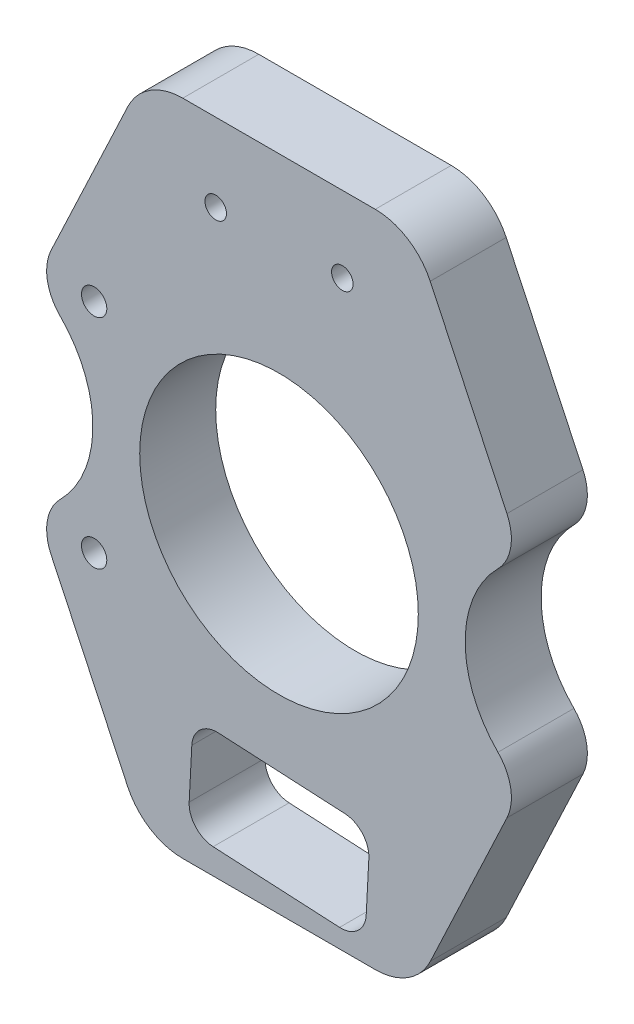
ISO-10303-21;
HEADER;
FILE_DESCRIPTION(('STEP AP214'),'2;1');
FILE_NAME('part.step','',(''),(''),'','','');
FILE_SCHEMA(('AUTOMOTIVE_DESIGN { 1 0 10303 214 1 1 1 1 }'));
ENDSEC;
DATA;
#1=APPLICATION_CONTEXT('core data for automotive mechanical design processes');
#2=APPLICATION_PROTOCOL_DEFINITION('international standard','automotive_design',2000,#1);
#3=PRODUCT_CONTEXT('',#1,'mechanical');
#4=PRODUCT('Part','Part','',(#3));
#5=PRODUCT_RELATED_PRODUCT_CATEGORY('part','',(#4));
#6=PRODUCT_DEFINITION_FORMATION('','',#4);
#7=PRODUCT_DEFINITION_CONTEXT('part definition',#1,'design');
#8=PRODUCT_DEFINITION('design','',#6,#7);
#9=PRODUCT_DEFINITION_SHAPE('','',#8);
#10=(LENGTH_UNIT() NAMED_UNIT(*) SI_UNIT(.MILLI.,.METRE.));
#11=(NAMED_UNIT(*) PLANE_ANGLE_UNIT() SI_UNIT($,.RADIAN.));
#12=(NAMED_UNIT(*) SI_UNIT($,.STERADIAN.) SOLID_ANGLE_UNIT());
#13=UNCERTAINTY_MEASURE_WITH_UNIT(LENGTH_MEASURE(1.E-05),#10,'distance_accuracy_value','');
#14=(GEOMETRIC_REPRESENTATION_CONTEXT(3) GLOBAL_UNCERTAINTY_ASSIGNED_CONTEXT((#13)) GLOBAL_UNIT_ASSIGNED_CONTEXT((#10,
#11,#12)) REPRESENTATION_CONTEXT('',''));
#15=CARTESIAN_POINT('',(0.,0.,0.));
#16=DIRECTION('',(0.,0.,1.));
#17=DIRECTION('',(1.,0.,0.));
#18=AXIS2_PLACEMENT_3D('',#15,#16,#17);
#19=CARTESIAN_POINT('',(38.0693004201398,23.9998999467089,30.));
#20=DIRECTION('',(0.,0.,-1.));
#21=DIRECTION('',(-1.,0.,0.));
#22=AXIS2_PLACEMENT_3D('',#19,#20,#21);
#23=PLANE('',#22);
#24=DIRECTION('',(-0.998629534754574,0.0523359562429441,0.));
#25=VECTOR('',#24,1.);
#26=CARTESIAN_POINT('',(-35.998752841269,10.5489732913392,30.));
#27=LINE('',#26,#25);
#28=CARTESIAN_POINT('',(23.9190192440055,7.4088159167626,30.));
#29=VERTEX_POINT('',#28);
#30=CARTESIAN_POINT('',(-26.0124574937233,10.0256137289098,30.));
#31=VERTEX_POINT('',#30);
#32=EDGE_CURVE('E380',#29,#31,#27,.T.);
#33=ORIENTED_EDGE('',*,*,#32,.T.);
#34=CARTESIAN_POINT('',(-25.4890979312938,20.0119090764555,30.));
#35=DIRECTION('',(0.,0.,-1.));
#36=DIRECTION('',(-1.,0.,0.));
#37=AXIS2_PLACEMENT_3D('',#34,#35,#36);
#38=CIRCLE('',#37,10.);
#39=CARTESIAN_POINT('',(-35.4753932788395,20.535268638885,30.));
#40=VERTEX_POINT('',#39);
#41=EDGE_CURVE('E353',#31,#40,#38,.T.);
#42=ORIENTED_EDGE('',*,*,#41,.T.);
#43=DIRECTION('',(0.0523359562429445,0.998629534754574,0.));
#44=VECTOR('',#43,1.);
#45=CARTESIAN_POINT('',(-33.9053145915512,50.4941546815222,30.));
#46=LINE('',#45,#44);
#47=CARTESIAN_POINT('',(-34.4286741539807,40.5078593339764,30.));
#48=VERTEX_POINT('',#47);
#49=EDGE_CURVE('E382',#40,#48,#46,.T.);
#50=ORIENTED_EDGE('',*,*,#49,.T.);
#51=CARTESIAN_POINT('',(-24.4423788064349,39.984499771547,30.));
#52=DIRECTION('',(0.,0.,-1.));
#53=DIRECTION('',(-1.,0.,0.));
#54=AXIS2_PLACEMENT_3D('',#51,#52,#53);
#55=CIRCLE('',#54,10.);
#56=CARTESIAN_POINT('',(-23.9190192440055,49.9707951190927,30.));
#57=VERTEX_POINT('',#56);
#58=EDGE_CURVE('E61',#48,#57,#55,.T.);
#59=ORIENTED_EDGE('',*,*,#58,.T.);
#60=DIRECTION('',(0.998629534754574,-0.0523359562429446,0.));
#61=VECTOR('',#60,1.);
#62=CARTESIAN_POINT('',(35.998752841269,46.830637744516,30.));
#63=LINE('',#62,#61);
#64=CARTESIAN_POINT('',(26.0124574937232,47.3539973069455,30.));
#65=VERTEX_POINT('',#64);
#66=EDGE_CURVE('E376',#57,#65,#63,.T.);
#67=ORIENTED_EDGE('',*,*,#66,.T.);
#68=CARTESIAN_POINT('',(25.4890979312938,37.3677019593998,30.));
#69=DIRECTION('',(0.,0.,-1.));
#70=DIRECTION('',(-1.,0.,0.));
#71=AXIS2_PLACEMENT_3D('',#68,#69,#70);
#72=CIRCLE('',#71,10.);
#73=CARTESIAN_POINT('',(35.4753932788395,36.8443423969703,30.));
#74=VERTEX_POINT('',#73);
#75=EDGE_CURVE('E11',#65,#74,#72,.T.);
#76=ORIENTED_EDGE('',*,*,#75,.T.);
#77=DIRECTION('',(-0.0523359562429445,-0.998629534754574,0.));
#78=VECTOR('',#77,1.);
#79=CARTESIAN_POINT('',(35.998752841269,46.830637744516,30.));
#80=LINE('',#79,#78);
#81=CARTESIAN_POINT('',(34.4286741539806,16.8717517018789,30.));
#82=VERTEX_POINT('',#81);
#83=EDGE_CURVE('E374',#74,#82,#80,.T.);
#84=ORIENTED_EDGE('',*,*,#83,.T.);
#85=CARTESIAN_POINT('',(24.4423788064349,17.3951112643083,30.));
#86=DIRECTION('',(0.,0.,-1.));
#87=DIRECTION('',(-1.,0.,0.));
#88=AXIS2_PLACEMENT_3D('',#85,#86,#87);
#89=CIRCLE('',#88,10.);
#90=EDGE_CURVE('E349',#82,#29,#89,.T.);
#91=ORIENTED_EDGE('',*,*,#90,.T.);
#92=EDGE_LOOP('',(#33,#42,#50,#59,#67,#76,#84,#91));
#93=FACE_BOUND('',#92,.T.);
#94=DIRECTION('',(1.,-1.29580053179329E-13,0.));
#95=VECTOR('',#94,1.);
#96=CARTESIAN_POINT('',(-38.,4.92404202081449E-12,30.));
#97=LINE('',#96,#95);
#98=CARTESIAN_POINT('',(-38.,5.25274268525777E-12,30.));
#99=VERTEX_POINT('',#98);
#100=CARTESIAN_POINT('',(38.0000000000001,5.61581336988582E-12,30.));
#101=VERTEX_POINT('',#100);
#102=EDGE_CURVE('E200',#99,#101,#97,.T.);
#103=ORIENTED_EDGE('',*,*,#102,.T.);
#104=CARTESIAN_POINT('',(38.0693004201398,23.9998999467089,30.));
#105=DIRECTION('',(0.,0.,1.));
#106=DIRECTION('',(-1.,0.,0.));
#107=AXIS2_PLACEMENT_3D('',#104,#105,#106);
#108=CIRCLE('',#107,24.);
#109=CARTESIAN_POINT('',(59.7661609006696,13.7409406774445,30.));
#110=VERTEX_POINT('',#109);
#111=EDGE_CURVE('E204',#101,#110,#108,.T.);
#112=ORIENTED_EDGE('',*,*,#111,.T.);
#113=DIRECTION('',(0.426346779523004,0.904559795475326,0.));
#114=VECTOR('',#113,1.);
#115=CARTESIAN_POINT('',(59.7661609006696,13.7409406774445,30.));
#116=LINE('',#115,#114);
#117=CARTESIAN_POINT('',(90.0082162674247,77.904079068946,30.));
#118=VERTEX_POINT('',#117);
#119=EDGE_CURVE('E225',#110,#118,#116,.T.);
#120=ORIENTED_EDGE('',*,*,#119,.T.);
#121=CARTESIAN_POINT('',(73.5,85.6849077952408,30.));
#122=DIRECTION('',(0.,0.,1.));
#123=DIRECTION('',(-1.,0.,0.));
#124=AXIS2_PLACEMENT_3D('',#121,#122,#123);
#125=CIRCLE('',#124,18.25);
#126=CARTESIAN_POINT('',(86.4422244101156,98.5519714586494,30.));
#127=VERTEX_POINT('',#126);
#128=EDGE_CURVE('E227',#118,#127,#125,.T.);
#129=ORIENTED_EDGE('',*,*,#128,.T.);
#130=CARTESIAN_POINT('',(117.999977081356,129.926455459837,30.));
#131=DIRECTION('',(0.,0.,-1.));
#132=DIRECTION('',(1.,0.,0.));
#133=AXIS2_PLACEMENT_3D('',#130,#131,#132);
#134=CIRCLE('',#133,44.5);
#135=CARTESIAN_POINT('',(86.4422244101156,161.300939461025,30.));
#136=VERTEX_POINT('',#135);
#137=EDGE_CURVE('E232',#127,#136,#134,.T.);
#138=ORIENTED_EDGE('',*,*,#137,.T.);
#139=CARTESIAN_POINT('',(73.5,174.168003124434,30.));
#140=DIRECTION('',(0.,0.,1.));
#141=DIRECTION('',(1.,0.,0.));
#142=AXIS2_PLACEMENT_3D('',#139,#140,#141);
#143=CIRCLE('',#142,18.25);
#144=CARTESIAN_POINT('',(90.0082162674247,181.948831850729,30.));
#145=VERTEX_POINT('',#144);
#146=EDGE_CURVE('E234',#136,#145,#143,.T.);
#147=ORIENTED_EDGE('',*,*,#146,.T.);
#148=DIRECTION('',(-0.426346779523004,0.904559795475326,0.));
#149=VECTOR('',#148,1.);
#150=CARTESIAN_POINT('',(59.7094350914078,246.232322708552,30.));
#151=LINE('',#150,#149);
#152=CARTESIAN_POINT('',(59.7094350914078,246.232322708552,30.));
#153=VERTEX_POINT('',#152);
#154=EDGE_CURVE('E236',#145,#153,#151,.T.);
#155=ORIENTED_EDGE('',*,*,#154,.T.);
#156=CARTESIAN_POINT('',(38.,236.,30.));
#157=DIRECTION('',(0.,0.,1.));
#158=DIRECTION('',(1.,0.,0.));
#159=AXIS2_PLACEMENT_3D('',#156,#157,#158);
#160=CIRCLE('',#159,24.);
#161=CARTESIAN_POINT('',(38.,260.,30.));
#162=VERTEX_POINT('',#161);
#163=EDGE_CURVE('E238',#153,#162,#160,.T.);
#164=ORIENTED_EDGE('',*,*,#163,.T.);
#165=DIRECTION('',(-1.,0.,0.));
#166=VECTOR('',#165,1.);
#167=CARTESIAN_POINT('',(-38.,260.,30.));
#168=LINE('',#167,#166);
#169=CARTESIAN_POINT('',(-38.,260.,30.));
#170=VERTEX_POINT('',#169);
#171=EDGE_CURVE('E240',#162,#170,#168,.T.);
#172=ORIENTED_EDGE('',*,*,#171,.T.);
#173=CARTESIAN_POINT('',(-38.,236.,30.));
#174=DIRECTION('',(0.,0.,1.));
#175=DIRECTION('',(-1.,0.,0.));
#176=AXIS2_PLACEMENT_3D('',#173,#174,#175);
#177=CIRCLE('',#176,24.);
#178=CARTESIAN_POINT('',(-59.7094350914078,246.232322708552,30.));
#179=VERTEX_POINT('',#178);
#180=EDGE_CURVE('E242',#170,#179,#177,.T.);
#181=ORIENTED_EDGE('',*,*,#180,.T.);
#182=DIRECTION('',(-0.426346779523004,-0.904559795475326,0.));
#183=VECTOR('',#182,1.);
#184=CARTESIAN_POINT('',(-59.7094350914078,246.232322708552,30.));
#185=LINE('',#184,#183);
#186=CARTESIAN_POINT('',(-90.0082162674247,181.948831850729,30.));
#187=VERTEX_POINT('',#186);
#188=EDGE_CURVE('E244',#179,#187,#185,.T.);
#189=ORIENTED_EDGE('',*,*,#188,.T.);
#190=CARTESIAN_POINT('',(-73.5,174.168003124434,30.));
#191=DIRECTION('',(0.,0.,1.));
#192=DIRECTION('',(-1.,0.,0.));
#193=AXIS2_PLACEMENT_3D('',#190,#191,#192);
#194=CIRCLE('',#193,18.25);
#195=CARTESIAN_POINT('',(-86.4422244101156,161.300939461025,30.));
#196=VERTEX_POINT('',#195);
#197=EDGE_CURVE('E246',#187,#196,#194,.T.);
#198=ORIENTED_EDGE('',*,*,#197,.T.);
#199=CARTESIAN_POINT('',(-117.999977081356,129.926455459837,30.));
#200=DIRECTION('',(0.,0.,-1.));
#201=DIRECTION('',(-1.,0.,0.));
#202=AXIS2_PLACEMENT_3D('',#199,#200,#201);
#203=CIRCLE('',#202,44.5);
#204=CARTESIAN_POINT('',(-86.4422244101156,98.5519714586494,30.));
#205=VERTEX_POINT('',#204);
#206=EDGE_CURVE('E248',#196,#205,#203,.T.);
#207=ORIENTED_EDGE('',*,*,#206,.T.);
#208=CARTESIAN_POINT('',(-73.5,85.6849077952408,30.));
#209=DIRECTION('',(0.,0.,1.));
#210=DIRECTION('',(1.,0.,0.));
#211=AXIS2_PLACEMENT_3D('',#208,#209,#210);
#212=CIRCLE('',#211,18.25);
#213=CARTESIAN_POINT('',(-90.0082162674247,77.904079068946,30.));
#214=VERTEX_POINT('',#213);
#215=EDGE_CURVE('E250',#205,#214,#212,.T.);
#216=ORIENTED_EDGE('',*,*,#215,.T.);
#217=DIRECTION('',(0.426346779523004,-0.904559795475326,0.));
#218=VECTOR('',#217,1.);
#219=CARTESIAN_POINT('',(-59.7661609006695,13.7409406774445,30.));
#220=LINE('',#219,#218);
#221=CARTESIAN_POINT('',(-59.7661609006695,13.7409406774445,30.));
#222=VERTEX_POINT('',#221);
#223=EDGE_CURVE('E252',#214,#222,#220,.T.);
#224=ORIENTED_EDGE('',*,*,#223,.T.);
#225=CARTESIAN_POINT('',(-38.0693004201397,23.9998999467089,30.));
#226=DIRECTION('',(0.,0.,1.));
#227=DIRECTION('',(1.,0.,0.));
#228=AXIS2_PLACEMENT_3D('',#225,#226,#227);
#229=CIRCLE('',#228,24.0000000000003);
#230=EDGE_CURVE('E207',#222,#99,#229,.T.);
#231=ORIENTED_EDGE('',*,*,#230,.T.);
#232=EDGE_LOOP('',(#103,#112,#120,#129,#138,#147,#155,#164,#172,#181,#189,#198,#207,#216,#224,#231));
#233=FACE_BOUND('',#232,.T.);
#234=CARTESIAN_POINT('',(0.,130.,30.));
#235=DIRECTION('',(0.,0.,1.));
#236=DIRECTION('',(1.,0.,0.));
#237=AXIS2_PLACEMENT_3D('',#234,#235,#236);
#238=CIRCLE('',#237,55.);
#239=CARTESIAN_POINT('',(55.,130.,30.));
#240=VERTEX_POINT('',#239);
#241=EDGE_CURVE('E258',#240,#240,#238,.T.);
#242=ORIENTED_EDGE('',*,*,#241,.F.);
#243=EDGE_LOOP('',(#242));
#244=FACE_BOUND('',#243,.T.);
#245=CARTESIAN_POINT('',(-73.,173.,30.));
#246=DIRECTION('',(0.,0.,1.));
#247=DIRECTION('',(-1.,0.,0.));
#248=AXIS2_PLACEMENT_3D('',#245,#246,#247);
#249=CIRCLE('',#248,5.00000000000001);
#250=CARTESIAN_POINT('',(-78.,173.,30.));
#251=VERTEX_POINT('',#250);
#252=EDGE_CURVE('E413',#251,#251,#249,.T.);
#253=ORIENTED_EDGE('',*,*,#252,.F.);
#254=EDGE_LOOP('',(#253));
#255=FACE_BOUND('',#254,.T.);
#256=CARTESIAN_POINT('',(-73.,87.,30.));
#257=DIRECTION('',(0.,0.,1.));
#258=DIRECTION('',(1.,0.,0.));
#259=AXIS2_PLACEMENT_3D('',#256,#257,#258);
#260=CIRCLE('',#259,5.00000000000001);
#261=CARTESIAN_POINT('',(-68.,87.,30.));
#262=VERTEX_POINT('',#261);
#263=EDGE_CURVE('E407',#262,#262,#260,.T.);
#264=ORIENTED_EDGE('',*,*,#263,.F.);
#265=EDGE_LOOP('',(#264));
#266=FACE_BOUND('',#265,.T.);
#267=CARTESIAN_POINT('',(-24.9923847578196,229.127379678136,30.));
#268=DIRECTION('',(0.,0.,1.));
#269=DIRECTION('',(1.,0.,0.));
#270=AXIS2_PLACEMENT_3D('',#267,#268,#269);
#271=CIRCLE('',#270,4.25);
#272=CARTESIAN_POINT('',(-20.7423847578196,229.127379678136,30.));
#273=VERTEX_POINT('',#272);
#274=EDGE_CURVE('E401',#273,#273,#271,.T.);
#275=ORIENTED_EDGE('',*,*,#274,.F.);
#276=EDGE_LOOP('',(#275));
#277=FACE_BOUND('',#276,.T.);
#278=CARTESIAN_POINT('',(25.,230.,30.));
#279=DIRECTION('',(0.,0.,1.));
#280=DIRECTION('',(1.,0.,0.));
#281=AXIS2_PLACEMENT_3D('',#278,#279,#280);
#282=CIRCLE('',#281,4.25);
#283=CARTESIAN_POINT('',(29.25,230.,30.));
#284=VERTEX_POINT('',#283);
#285=EDGE_CURVE('E395',#284,#284,#282,.T.);
#286=ORIENTED_EDGE('',*,*,#285,.F.);
#287=EDGE_LOOP('',(#286));
#288=FACE_BOUND('',#287,.T.);
#289=ADVANCED_FACE('F39',(#93,#233,#244,#255,#266,#277,#288),#23,.F.);
#290=CARTESIAN_POINT('',(38.0693004201398,23.9998999467089,0.));
#291=DIRECTION('',(0.,0.,-1.));
#292=DIRECTION('',(-1.,0.,0.));
#293=AXIS2_PLACEMENT_3D('',#290,#291,#292);
#294=PLANE('',#293);
#295=DIRECTION('',(0.998629534754574,-0.0523359562429446,0.));
#296=VECTOR('',#295,1.);
#297=CARTESIAN_POINT('',(35.998752841269,46.830637744516,0.));
#298=LINE('',#297,#296);
#299=CARTESIAN_POINT('',(-23.9190192440055,49.9707951190927,0.));
#300=VERTEX_POINT('',#299);
#301=CARTESIAN_POINT('',(26.0124574937232,47.3539973069455,0.));
#302=VERTEX_POINT('',#301);
#303=EDGE_CURVE('E362',#300,#302,#298,.T.);
#304=ORIENTED_EDGE('',*,*,#303,.F.);
#305=CARTESIAN_POINT('',(-24.4423788064349,39.984499771547,0.));
#306=DIRECTION('',(0.,0.,-1.));
#307=DIRECTION('',(-1.,0.,0.));
#308=AXIS2_PLACEMENT_3D('',#305,#306,#307);
#309=CIRCLE('',#308,10.);
#310=CARTESIAN_POINT('',(-34.4286741539807,40.5078593339764,0.));
#311=VERTEX_POINT('',#310);
#312=EDGE_CURVE('E355',#300,#311,#309,.F.);
#313=ORIENTED_EDGE('',*,*,#312,.T.);
#314=DIRECTION('',(0.0523359562429445,0.998629534754574,0.));
#315=VECTOR('',#314,1.);
#316=CARTESIAN_POINT('',(-33.9053145915512,50.4941546815222,0.));
#317=LINE('',#316,#315);
#318=CARTESIAN_POINT('',(-35.4753932788395,20.535268638885,0.));
#319=VERTEX_POINT('',#318);
#320=EDGE_CURVE('E384',#319,#311,#317,.T.);
#321=ORIENTED_EDGE('',*,*,#320,.F.);
#322=CARTESIAN_POINT('',(-25.4890979312938,20.0119090764555,0.));
#323=DIRECTION('',(0.,0.,-1.));
#324=DIRECTION('',(-1.,0.,0.));
#325=AXIS2_PLACEMENT_3D('',#322,#323,#324);
#326=CIRCLE('',#325,10.);
#327=CARTESIAN_POINT('',(-26.0124574937233,10.0256137289098,0.));
#328=VERTEX_POINT('',#327);
#329=EDGE_CURVE('E351',#319,#328,#326,.F.);
#330=ORIENTED_EDGE('',*,*,#329,.T.);
#331=DIRECTION('',(-0.998629534754574,0.0523359562429441,0.));
#332=VECTOR('',#331,1.);
#333=CARTESIAN_POINT('',(-35.998752841269,10.5489732913392,0.));
#334=LINE('',#333,#332);
#335=CARTESIAN_POINT('',(23.9190192440055,7.4088159167626,0.));
#336=VERTEX_POINT('',#335);
#337=EDGE_CURVE('E390',#336,#328,#334,.T.);
#338=ORIENTED_EDGE('',*,*,#337,.F.);
#339=CARTESIAN_POINT('',(24.4423788064349,17.3951112643083,0.));
#340=DIRECTION('',(0.,0.,-1.));
#341=DIRECTION('',(-1.,0.,0.));
#342=AXIS2_PLACEMENT_3D('',#339,#340,#341);
#343=CIRCLE('',#342,10.);
#344=CARTESIAN_POINT('',(34.4286741539806,16.8717517018789,0.));
#345=VERTEX_POINT('',#344);
#346=EDGE_CURVE('E347',#336,#345,#343,.F.);
#347=ORIENTED_EDGE('',*,*,#346,.T.);
#348=DIRECTION('',(-0.0523359562429445,-0.998629534754574,0.));
#349=VECTOR('',#348,1.);
#350=CARTESIAN_POINT('',(35.998752841269,46.830637744516,0.));
#351=LINE('',#350,#349);
#352=CARTESIAN_POINT('',(35.4753932788395,36.8443423969703,0.));
#353=VERTEX_POINT('',#352);
#354=EDGE_CURVE('E364',#353,#345,#351,.T.);
#355=ORIENTED_EDGE('',*,*,#354,.F.);
#356=CARTESIAN_POINT('',(25.4890979312938,37.3677019593998,0.));
#357=DIRECTION('',(0.,0.,-1.));
#358=DIRECTION('',(-1.,0.,0.));
#359=AXIS2_PLACEMENT_3D('',#356,#357,#358);
#360=CIRCLE('',#359,10.);
#361=EDGE_CURVE('E47',#353,#302,#360,.F.);
#362=ORIENTED_EDGE('',*,*,#361,.T.);
#363=EDGE_LOOP('',(#304,#313,#321,#330,#338,#347,#355,#362));
#364=FACE_BOUND('',#363,.T.);
#365=CARTESIAN_POINT('',(-24.9923847578196,229.127379678136,0.));
#366=DIRECTION('',(0.,0.,1.));
#367=DIRECTION('',(1.,0.,0.));
#368=AXIS2_PLACEMENT_3D('',#365,#366,#367);
#369=CIRCLE('',#368,4.25);
#370=CARTESIAN_POINT('',(-20.7423847578196,229.127379678136,0.));
#371=VERTEX_POINT('',#370);
#372=EDGE_CURVE('E398',#371,#371,#369,.T.);
#373=ORIENTED_EDGE('',*,*,#372,.T.);
#374=EDGE_LOOP('',(#373));
#375=FACE_BOUND('',#374,.T.);
#376=CARTESIAN_POINT('',(-73.,173.,0.));
#377=DIRECTION('',(0.,0.,1.));
#378=DIRECTION('',(-1.,0.,0.));
#379=AXIS2_PLACEMENT_3D('',#376,#377,#378);
#380=CIRCLE('',#379,5.00000000000001);
#381=CARTESIAN_POINT('',(-78.,173.,0.));
#382=VERTEX_POINT('',#381);
#383=EDGE_CURVE('E410',#382,#382,#380,.T.);
#384=ORIENTED_EDGE('',*,*,#383,.T.);
#385=EDGE_LOOP('',(#384));
#386=FACE_BOUND('',#385,.T.);
#387=DIRECTION('',(1.,1.47784562365416E-13,0.));
#388=VECTOR('',#387,1.);
#389=CARTESIAN_POINT('',(0.,0.,0.));
#390=LINE('',#389,#388);
#391=CARTESIAN_POINT('',(-38.,5.25274268525777E-12,0.));
#392=VERTEX_POINT('',#391);
#393=CARTESIAN_POINT('',(38.0000000000001,5.61581336988582E-12,0.));
#394=VERTEX_POINT('',#393);
#395=EDGE_CURVE('E216',#392,#394,#390,.T.);
#396=ORIENTED_EDGE('',*,*,#395,.F.);
#397=CARTESIAN_POINT('',(-38.0693004201397,23.9998999467089,0.));
#398=DIRECTION('',(0.,0.,1.));
#399=DIRECTION('',(1.,0.,0.));
#400=AXIS2_PLACEMENT_3D('',#397,#398,#399);
#401=CIRCLE('',#400,24.0000000000003);
#402=CARTESIAN_POINT('',(-59.7661609006695,13.7409406774445,0.));
#403=VERTEX_POINT('',#402);
#404=EDGE_CURVE('E211',#403,#392,#401,.T.);
#405=ORIENTED_EDGE('',*,*,#404,.F.);
#406=DIRECTION('',(0.426346779523004,-0.904559795475326,0.));
#407=VECTOR('',#406,1.);
#408=CARTESIAN_POINT('',(-59.7661609006695,13.7409406774445,0.));
#409=LINE('',#408,#407);
#410=CARTESIAN_POINT('',(-90.0082162674247,77.904079068946,0.));
#411=VERTEX_POINT('',#410);
#412=EDGE_CURVE('E284',#411,#403,#409,.T.);
#413=ORIENTED_EDGE('',*,*,#412,.F.);
#414=CARTESIAN_POINT('',(-73.5,85.6849077952408,0.));
#415=DIRECTION('',(0.,0.,1.));
#416=DIRECTION('',(1.,0.,0.));
#417=AXIS2_PLACEMENT_3D('',#414,#415,#416);
#418=CIRCLE('',#417,18.25);
#419=CARTESIAN_POINT('',(-86.4422244101156,98.5519714586494,0.));
#420=VERTEX_POINT('',#419);
#421=EDGE_CURVE('E282',#420,#411,#418,.T.);
#422=ORIENTED_EDGE('',*,*,#421,.F.);
#423=CARTESIAN_POINT('',(-117.999977081356,129.926455459837,0.));
#424=DIRECTION('',(0.,0.,-1.));
#425=DIRECTION('',(-1.,0.,0.));
#426=AXIS2_PLACEMENT_3D('',#423,#424,#425);
#427=CIRCLE('',#426,44.5);
#428=CARTESIAN_POINT('',(-86.4422244101156,161.300939461025,0.));
#429=VERTEX_POINT('',#428);
#430=EDGE_CURVE('E280',#429,#420,#427,.T.);
#431=ORIENTED_EDGE('',*,*,#430,.F.);
#432=CARTESIAN_POINT('',(-73.5,174.168003124434,0.));
#433=DIRECTION('',(0.,0.,1.));
#434=DIRECTION('',(-1.,0.,0.));
#435=AXIS2_PLACEMENT_3D('',#432,#433,#434);
#436=CIRCLE('',#435,18.25);
#437=CARTESIAN_POINT('',(-90.0082162674247,181.948831850729,0.));
#438=VERTEX_POINT('',#437);
#439=EDGE_CURVE('E278',#438,#429,#436,.T.);
#440=ORIENTED_EDGE('',*,*,#439,.F.);
#441=DIRECTION('',(-0.426346779523004,-0.904559795475326,0.));
#442=VECTOR('',#441,1.);
#443=CARTESIAN_POINT('',(-59.7094350914078,246.232322708552,0.));
#444=LINE('',#443,#442);
#445=CARTESIAN_POINT('',(-59.7094350914078,246.232322708552,0.));
#446=VERTEX_POINT('',#445);
#447=EDGE_CURVE('E276',#446,#438,#444,.T.);
#448=ORIENTED_EDGE('',*,*,#447,.F.);
#449=CARTESIAN_POINT('',(-38.,236.,0.));
#450=DIRECTION('',(0.,0.,1.));
#451=DIRECTION('',(-1.,0.,0.));
#452=AXIS2_PLACEMENT_3D('',#449,#450,#451);
#453=CIRCLE('',#452,24.);
#454=CARTESIAN_POINT('',(-38.,260.,0.));
#455=VERTEX_POINT('',#454);
#456=EDGE_CURVE('E274',#455,#446,#453,.T.);
#457=ORIENTED_EDGE('',*,*,#456,.F.);
#458=DIRECTION('',(-1.,0.,0.));
#459=VECTOR('',#458,1.);
#460=CARTESIAN_POINT('',(-38.,260.,0.));
#461=LINE('',#460,#459);
#462=CARTESIAN_POINT('',(38.,260.,0.));
#463=VERTEX_POINT('',#462);
#464=EDGE_CURVE('E272',#463,#455,#461,.T.);
#465=ORIENTED_EDGE('',*,*,#464,.F.);
#466=CARTESIAN_POINT('',(38.,236.,0.));
#467=DIRECTION('',(0.,0.,1.));
#468=DIRECTION('',(1.,0.,0.));
#469=AXIS2_PLACEMENT_3D('',#466,#467,#468);
#470=CIRCLE('',#469,24.);
#471=CARTESIAN_POINT('',(59.7094350914078,246.232322708552,0.));
#472=VERTEX_POINT('',#471);
#473=EDGE_CURVE('E270',#472,#463,#470,.T.);
#474=ORIENTED_EDGE('',*,*,#473,.F.);
#475=DIRECTION('',(-0.426346779523004,0.904559795475326,0.));
#476=VECTOR('',#475,1.);
#477=CARTESIAN_POINT('',(59.7094350914078,246.232322708552,0.));
#478=LINE('',#477,#476);
#479=CARTESIAN_POINT('',(90.0082162674247,181.948831850729,0.));
#480=VERTEX_POINT('',#479);
#481=EDGE_CURVE('E268',#480,#472,#478,.T.);
#482=ORIENTED_EDGE('',*,*,#481,.F.);
#483=CARTESIAN_POINT('',(73.5,174.168003124434,0.));
#484=DIRECTION('',(0.,0.,1.));
#485=DIRECTION('',(1.,0.,0.));
#486=AXIS2_PLACEMENT_3D('',#483,#484,#485);
#487=CIRCLE('',#486,18.25);
#488=CARTESIAN_POINT('',(86.4422244101156,161.300939461025,0.));
#489=VERTEX_POINT('',#488);
#490=EDGE_CURVE('E266',#489,#480,#487,.T.);
#491=ORIENTED_EDGE('',*,*,#490,.F.);
#492=CARTESIAN_POINT('',(117.999977081356,129.926455459837,0.));
#493=DIRECTION('',(0.,0.,-1.));
#494=DIRECTION('',(1.,0.,0.));
#495=AXIS2_PLACEMENT_3D('',#492,#493,#494);
#496=CIRCLE('',#495,44.5);
#497=CARTESIAN_POINT('',(86.4422244101156,98.5519714586494,0.));
#498=VERTEX_POINT('',#497);
#499=EDGE_CURVE('E264',#498,#489,#496,.T.);
#500=ORIENTED_EDGE('',*,*,#499,.F.);
#501=CARTESIAN_POINT('',(73.5,85.6849077952408,0.));
#502=DIRECTION('',(0.,0.,1.));
#503=DIRECTION('',(-1.,0.,0.));
#504=AXIS2_PLACEMENT_3D('',#501,#502,#503);
#505=CIRCLE('',#504,18.25);
#506=CARTESIAN_POINT('',(90.0082162674247,77.904079068946,0.));
#507=VERTEX_POINT('',#506);
#508=EDGE_CURVE('E262',#507,#498,#505,.T.);
#509=ORIENTED_EDGE('',*,*,#508,.F.);
#510=DIRECTION('',(0.426346779523004,0.904559795475326,0.));
#511=VECTOR('',#510,1.);
#512=CARTESIAN_POINT('',(59.7661609006696,13.7409406774445,0.));
#513=LINE('',#512,#511);
#514=CARTESIAN_POINT('',(59.7661609006696,13.7409406774445,0.));
#515=VERTEX_POINT('',#514);
#516=EDGE_CURVE('E260',#515,#507,#513,.T.);
#517=ORIENTED_EDGE('',*,*,#516,.F.);
#518=CARTESIAN_POINT('',(38.0693004201398,23.9998999467089,0.));
#519=DIRECTION('',(0.,0.,1.));
#520=DIRECTION('',(-1.,0.,0.));
#521=AXIS2_PLACEMENT_3D('',#518,#519,#520);
#522=CIRCLE('',#521,24.);
#523=EDGE_CURVE('E257',#394,#515,#522,.T.);
#524=ORIENTED_EDGE('',*,*,#523,.F.);
#525=EDGE_LOOP('',(#396,#405,#413,#422,#431,#440,#448,#457,#465,#474,#482,#491,#500,#509,#517,#524));
#526=FACE_BOUND('',#525,.T.);
#527=CARTESIAN_POINT('',(0.,130.,0.));
#528=DIRECTION('',(0.,0.,1.));
#529=DIRECTION('',(1.,0.,0.));
#530=AXIS2_PLACEMENT_3D('',#527,#528,#529);
#531=CIRCLE('',#530,55.);
#532=CARTESIAN_POINT('',(55.,130.,0.));
#533=VERTEX_POINT('',#532);
#534=EDGE_CURVE('E416',#533,#533,#531,.T.);
#535=ORIENTED_EDGE('',*,*,#534,.T.);
#536=EDGE_LOOP('',(#535));
#537=FACE_BOUND('',#536,.T.);
#538=CARTESIAN_POINT('',(-73.,87.,0.));
#539=DIRECTION('',(0.,0.,1.));
#540=DIRECTION('',(1.,0.,0.));
#541=AXIS2_PLACEMENT_3D('',#538,#539,#540);
#542=CIRCLE('',#541,5.00000000000001);
#543=CARTESIAN_POINT('',(-68.,87.,0.));
#544=VERTEX_POINT('',#543);
#545=EDGE_CURVE('E404',#544,#544,#542,.T.);
#546=ORIENTED_EDGE('',*,*,#545,.T.);
#547=EDGE_LOOP('',(#546));
#548=FACE_BOUND('',#547,.T.);
#549=CARTESIAN_POINT('',(25.,230.,0.));
#550=DIRECTION('',(0.,0.,1.));
#551=DIRECTION('',(1.,0.,0.));
#552=AXIS2_PLACEMENT_3D('',#549,#550,#551);
#553=CIRCLE('',#552,4.25);
#554=CARTESIAN_POINT('',(29.25,230.,0.));
#555=VERTEX_POINT('',#554);
#556=EDGE_CURVE('E387',#555,#555,#553,.T.);
#557=ORIENTED_EDGE('',*,*,#556,.T.);
#558=EDGE_LOOP('',(#557));
#559=FACE_BOUND('',#558,.T.);
#560=ADVANCED_FACE('F360',(#364,#375,#386,#526,#537,#548,#559),#294,.T.);
#561=CARTESIAN_POINT('',(0.,0.,30.));
#562=DIRECTION('',(-1.47784562365416E-13,1.,0.));
#563=DIRECTION('',(-1.,-1.47784562365416E-13,0.));
#564=AXIS2_PLACEMENT_3D('',#561,#562,#563);
#565=PLANE('',#564);
#566=ORIENTED_EDGE('',*,*,#395,.T.);
#567=DIRECTION('',(0.,0.,-1.));
#568=VECTOR('',#567,1.);
#569=CARTESIAN_POINT('',(38.0000000000001,5.61581336988582E-12,30.));
#570=LINE('',#569,#568);
#571=EDGE_CURVE('E214',#101,#394,#570,.T.);
#572=ORIENTED_EDGE('',*,*,#571,.F.);
#573=ORIENTED_EDGE('',*,*,#102,.F.);
#574=DIRECTION('',(0.,0.,-1.));
#575=VECTOR('',#574,1.);
#576=CARTESIAN_POINT('',(-38.,5.25274268525777E-12,30.));
#577=LINE('',#576,#575);
#578=EDGE_CURVE('E255',#99,#392,#577,.T.);
#579=ORIENTED_EDGE('',*,*,#578,.T.);
#580=EDGE_LOOP('',(#566,#572,#573,#579));
#581=FACE_BOUND('',#580,.T.);
#582=ADVANCED_FACE('F215',(#581),#565,.F.);
#583=CARTESIAN_POINT('',(38.0693004201398,23.9998999467089,30.));
#584=DIRECTION('',(0.,0.,-1.));
#585=DIRECTION('',(-1.,0.,0.));
#586=AXIS2_PLACEMENT_3D('',#583,#584,#585);
#587=CYLINDRICAL_SURFACE('',#586,24.);
#588=ORIENTED_EDGE('',*,*,#523,.T.);
#589=DIRECTION('',(0.,0.,-1.));
#590=VECTOR('',#589,1.);
#591=CARTESIAN_POINT('',(59.7661609006696,13.7409406774445,30.));
#592=LINE('',#591,#590);
#593=EDGE_CURVE('E220',#110,#515,#592,.T.);
#594=ORIENTED_EDGE('',*,*,#593,.F.);
#595=ORIENTED_EDGE('',*,*,#111,.F.);
#596=ORIENTED_EDGE('',*,*,#571,.T.);
#597=EDGE_LOOP('',(#588,#594,#595,#596));
#598=FACE_BOUND('',#597,.T.);
#599=ADVANCED_FACE('F222',(#598),#587,.T.);
#600=CARTESIAN_POINT('',(59.7661609006696,13.7409406774445,30.));
#601=DIRECTION('',(-0.904559795475326,0.426346779523004,0.));
#602=DIRECTION('',(-0.426346779523004,-0.904559795475326,0.));
#603=AXIS2_PLACEMENT_3D('',#600,#601,#602);
#604=PLANE('',#603);
#605=ORIENTED_EDGE('',*,*,#516,.T.);
#606=DIRECTION('',(0.,0.,-1.));
#607=VECTOR('',#606,1.);
#608=CARTESIAN_POINT('',(90.0082162674247,77.904079068946,30.));
#609=LINE('',#608,#607);
#610=EDGE_CURVE('E325',#118,#507,#609,.T.);
#611=ORIENTED_EDGE('',*,*,#610,.F.);
#612=ORIENTED_EDGE('',*,*,#119,.F.);
#613=ORIENTED_EDGE('',*,*,#593,.T.);
#614=EDGE_LOOP('',(#605,#611,#612,#613));
#615=FACE_BOUND('',#614,.T.);
#616=ADVANCED_FACE('F494',(#615),#604,.F.);
#617=CARTESIAN_POINT('',(73.5,85.6849077952408,30.));
#618=DIRECTION('',(0.,0.,-1.));
#619=DIRECTION('',(-1.,0.,0.));
#620=AXIS2_PLACEMENT_3D('',#617,#618,#619);
#621=CYLINDRICAL_SURFACE('',#620,18.25);
#622=ORIENTED_EDGE('',*,*,#508,.T.);
#623=DIRECTION('',(0.,0.,-1.));
#624=VECTOR('',#623,1.);
#625=CARTESIAN_POINT('',(86.4422244101156,98.5519714586494,30.));
#626=LINE('',#625,#624);
#627=EDGE_CURVE('E322',#127,#498,#626,.T.);
#628=ORIENTED_EDGE('',*,*,#627,.F.);
#629=ORIENTED_EDGE('',*,*,#128,.F.);
#630=ORIENTED_EDGE('',*,*,#610,.T.);
#631=EDGE_LOOP('',(#622,#628,#629,#630));
#632=FACE_BOUND('',#631,.T.);
#633=ADVANCED_FACE('F490',(#632),#621,.T.);
#634=CARTESIAN_POINT('',(117.999977081356,129.926455459837,30.));
#635=DIRECTION('',(0.,0.,-1.));
#636=DIRECTION('',(-1.,0.,0.));
#637=AXIS2_PLACEMENT_3D('',#634,#635,#636);
#638=CYLINDRICAL_SURFACE('',#637,44.5);
#639=ORIENTED_EDGE('',*,*,#499,.T.);
#640=DIRECTION('',(0.,0.,-1.));
#641=VECTOR('',#640,1.);
#642=CARTESIAN_POINT('',(86.4422244101156,161.300939461025,30.));
#643=LINE('',#642,#641);
#644=EDGE_CURVE('E319',#136,#489,#643,.T.);
#645=ORIENTED_EDGE('',*,*,#644,.F.);
#646=ORIENTED_EDGE('',*,*,#137,.F.);
#647=ORIENTED_EDGE('',*,*,#627,.T.);
#648=EDGE_LOOP('',(#639,#645,#646,#647));
#649=FACE_BOUND('',#648,.T.);
#650=ADVANCED_FACE('F486',(#649),#638,.F.);
#651=CARTESIAN_POINT('',(73.5,174.168003124434,30.));
#652=DIRECTION('',(0.,0.,-1.));
#653=DIRECTION('',(-1.,0.,0.));
#654=AXIS2_PLACEMENT_3D('',#651,#652,#653);
#655=CYLINDRICAL_SURFACE('',#654,18.25);
#656=ORIENTED_EDGE('',*,*,#490,.T.);
#657=DIRECTION('',(0.,0.,-1.));
#658=VECTOR('',#657,1.);
#659=CARTESIAN_POINT('',(90.0082162674247,181.948831850729,30.));
#660=LINE('',#659,#658);
#661=EDGE_CURVE('E316',#145,#480,#660,.T.);
#662=ORIENTED_EDGE('',*,*,#661,.F.);
#663=ORIENTED_EDGE('',*,*,#146,.F.);
#664=ORIENTED_EDGE('',*,*,#644,.T.);
#665=EDGE_LOOP('',(#656,#662,#663,#664));
#666=FACE_BOUND('',#665,.T.);
#667=ADVANCED_FACE('F482',(#666),#655,.T.);
#668=CARTESIAN_POINT('',(59.7094350914078,246.232322708552,30.));
#669=DIRECTION('',(-0.904559795475326,-0.426346779523004,0.));
#670=DIRECTION('',(0.426346779523004,-0.904559795475326,0.));
#671=AXIS2_PLACEMENT_3D('',#668,#669,#670);
#672=PLANE('',#671);
#673=ORIENTED_EDGE('',*,*,#481,.T.);
#674=DIRECTION('',(0.,0.,-1.));
#675=VECTOR('',#674,1.);
#676=CARTESIAN_POINT('',(59.7094350914078,246.232322708552,30.));
#677=LINE('',#676,#675);
#678=EDGE_CURVE('E313',#153,#472,#677,.T.);
#679=ORIENTED_EDGE('',*,*,#678,.F.);
#680=ORIENTED_EDGE('',*,*,#154,.F.);
#681=ORIENTED_EDGE('',*,*,#661,.T.);
#682=EDGE_LOOP('',(#673,#679,#680,#681));
#683=FACE_BOUND('',#682,.T.);
#684=ADVANCED_FACE('F478',(#683),#672,.F.);
#685=CARTESIAN_POINT('',(38.,236.,30.));
#686=DIRECTION('',(0.,0.,-1.));
#687=DIRECTION('',(-1.,0.,0.));
#688=AXIS2_PLACEMENT_3D('',#685,#686,#687);
#689=CYLINDRICAL_SURFACE('',#688,24.);
#690=ORIENTED_EDGE('',*,*,#473,.T.);
#691=DIRECTION('',(0.,0.,-1.));
#692=VECTOR('',#691,1.);
#693=CARTESIAN_POINT('',(38.,260.,30.));
#694=LINE('',#693,#692);
#695=EDGE_CURVE('E310',#162,#463,#694,.T.);
#696=ORIENTED_EDGE('',*,*,#695,.F.);
#697=ORIENTED_EDGE('',*,*,#163,.F.);
#698=ORIENTED_EDGE('',*,*,#678,.T.);
#699=EDGE_LOOP('',(#690,#696,#697,#698));
#700=FACE_BOUND('',#699,.T.);
#701=ADVANCED_FACE('F474',(#700),#689,.T.);
#702=CARTESIAN_POINT('',(-38.,260.,30.));
#703=DIRECTION('',(0.,-1.,0.));
#704=DIRECTION('',(0.,0.,-1.));
#705=AXIS2_PLACEMENT_3D('',#702,#703,#704);
#706=PLANE('',#705);
#707=ORIENTED_EDGE('',*,*,#464,.T.);
#708=DIRECTION('',(0.,0.,-1.));
#709=VECTOR('',#708,1.);
#710=CARTESIAN_POINT('',(-38.,260.,30.));
#711=LINE('',#710,#709);
#712=EDGE_CURVE('E307',#170,#455,#711,.T.);
#713=ORIENTED_EDGE('',*,*,#712,.F.);
#714=ORIENTED_EDGE('',*,*,#171,.F.);
#715=ORIENTED_EDGE('',*,*,#695,.T.);
#716=EDGE_LOOP('',(#707,#713,#714,#715));
#717=FACE_BOUND('',#716,.T.);
#718=ADVANCED_FACE('F470',(#717),#706,.F.);
#719=CARTESIAN_POINT('',(-38.,236.,30.));
#720=DIRECTION('',(0.,0.,-1.));
#721=DIRECTION('',(-1.,0.,0.));
#722=AXIS2_PLACEMENT_3D('',#719,#720,#721);
#723=CYLINDRICAL_SURFACE('',#722,24.);
#724=ORIENTED_EDGE('',*,*,#456,.T.);
#725=DIRECTION('',(0.,0.,-1.));
#726=VECTOR('',#725,1.);
#727=CARTESIAN_POINT('',(-59.7094350914078,246.232322708552,30.));
#728=LINE('',#727,#726);
#729=EDGE_CURVE('E304',#179,#446,#728,.T.);
#730=ORIENTED_EDGE('',*,*,#729,.F.);
#731=ORIENTED_EDGE('',*,*,#180,.F.);
#732=ORIENTED_EDGE('',*,*,#712,.T.);
#733=EDGE_LOOP('',(#724,#730,#731,#732));
#734=FACE_BOUND('',#733,.T.);
#735=ADVANCED_FACE('F466',(#734),#723,.T.);
#736=CARTESIAN_POINT('',(-59.7094350914078,246.232322708552,30.));
#737=DIRECTION('',(0.904559795475326,-0.426346779523004,0.));
#738=DIRECTION('',(0.426346779523004,0.904559795475326,0.));
#739=AXIS2_PLACEMENT_3D('',#736,#737,#738);
#740=PLANE('',#739);
#741=ORIENTED_EDGE('',*,*,#447,.T.);
#742=DIRECTION('',(0.,0.,-1.));
#743=VECTOR('',#742,1.);
#744=CARTESIAN_POINT('',(-90.0082162674247,181.948831850729,30.));
#745=LINE('',#744,#743);
#746=EDGE_CURVE('E301',#187,#438,#745,.T.);
#747=ORIENTED_EDGE('',*,*,#746,.F.);
#748=ORIENTED_EDGE('',*,*,#188,.F.);
#749=ORIENTED_EDGE('',*,*,#729,.T.);
#750=EDGE_LOOP('',(#741,#747,#748,#749));
#751=FACE_BOUND('',#750,.T.);
#752=ADVANCED_FACE('F462',(#751),#740,.F.);
#753=CARTESIAN_POINT('',(-73.5,174.168003124434,30.));
#754=DIRECTION('',(0.,0.,-1.));
#755=DIRECTION('',(-1.,0.,0.));
#756=AXIS2_PLACEMENT_3D('',#753,#754,#755);
#757=CYLINDRICAL_SURFACE('',#756,18.25);
#758=ORIENTED_EDGE('',*,*,#439,.T.);
#759=DIRECTION('',(0.,0.,-1.));
#760=VECTOR('',#759,1.);
#761=CARTESIAN_POINT('',(-86.4422244101156,161.300939461025,30.));
#762=LINE('',#761,#760);
#763=EDGE_CURVE('E298',#196,#429,#762,.T.);
#764=ORIENTED_EDGE('',*,*,#763,.F.);
#765=ORIENTED_EDGE('',*,*,#197,.F.);
#766=ORIENTED_EDGE('',*,*,#746,.T.);
#767=EDGE_LOOP('',(#758,#764,#765,#766));
#768=FACE_BOUND('',#767,.T.);
#769=ADVANCED_FACE('F458',(#768),#757,.T.);
#770=CARTESIAN_POINT('',(-117.999977081356,129.926455459837,30.));
#771=DIRECTION('',(0.,0.,-1.));
#772=DIRECTION('',(-1.,0.,0.));
#773=AXIS2_PLACEMENT_3D('',#770,#771,#772);
#774=CYLINDRICAL_SURFACE('',#773,44.5);
#775=ORIENTED_EDGE('',*,*,#430,.T.);
#776=DIRECTION('',(0.,0.,-1.));
#777=VECTOR('',#776,1.);
#778=CARTESIAN_POINT('',(-86.4422244101156,98.5519714586494,30.));
#779=LINE('',#778,#777);
#780=EDGE_CURVE('E295',#205,#420,#779,.T.);
#781=ORIENTED_EDGE('',*,*,#780,.F.);
#782=ORIENTED_EDGE('',*,*,#206,.F.);
#783=ORIENTED_EDGE('',*,*,#763,.T.);
#784=EDGE_LOOP('',(#775,#781,#782,#783));
#785=FACE_BOUND('',#784,.T.);
#786=ADVANCED_FACE('F454',(#785),#774,.F.);
#787=CARTESIAN_POINT('',(-73.5,85.6849077952408,30.));
#788=DIRECTION('',(0.,0.,-1.));
#789=DIRECTION('',(-1.,0.,0.));
#790=AXIS2_PLACEMENT_3D('',#787,#788,#789);
#791=CYLINDRICAL_SURFACE('',#790,18.25);
#792=ORIENTED_EDGE('',*,*,#421,.T.);
#793=DIRECTION('',(0.,0.,-1.));
#794=VECTOR('',#793,1.);
#795=CARTESIAN_POINT('',(-90.0082162674247,77.904079068946,30.));
#796=LINE('',#795,#794);
#797=EDGE_CURVE('E292',#214,#411,#796,.T.);
#798=ORIENTED_EDGE('',*,*,#797,.F.);
#799=ORIENTED_EDGE('',*,*,#215,.F.);
#800=ORIENTED_EDGE('',*,*,#780,.T.);
#801=EDGE_LOOP('',(#792,#798,#799,#800));
#802=FACE_BOUND('',#801,.T.);
#803=ADVANCED_FACE('F450',(#802),#791,.T.);
#804=CARTESIAN_POINT('',(-59.7661609006695,13.7409406774445,30.));
#805=DIRECTION('',(0.904559795475326,0.426346779523004,0.));
#806=DIRECTION('',(-0.426346779523004,0.904559795475326,0.));
#807=AXIS2_PLACEMENT_3D('',#804,#805,#806);
#808=PLANE('',#807);
#809=ORIENTED_EDGE('',*,*,#412,.T.);
#810=DIRECTION('',(0.,0.,-1.));
#811=VECTOR('',#810,1.);
#812=CARTESIAN_POINT('',(-59.7661609006695,13.7409406774445,30.));
#813=LINE('',#812,#811);
#814=EDGE_CURVE('E289',#222,#403,#813,.T.);
#815=ORIENTED_EDGE('',*,*,#814,.F.);
#816=ORIENTED_EDGE('',*,*,#223,.F.);
#817=ORIENTED_EDGE('',*,*,#797,.T.);
#818=EDGE_LOOP('',(#809,#815,#816,#817));
#819=FACE_BOUND('',#818,.T.);
#820=ADVANCED_FACE('F438',(#819),#808,.F.);
#821=CARTESIAN_POINT('',(-38.0693004201397,23.9998999467089,30.));
#822=DIRECTION('',(0.,0.,-1.));
#823=DIRECTION('',(-1.,0.,0.));
#824=AXIS2_PLACEMENT_3D('',#821,#822,#823);
#825=CYLINDRICAL_SURFACE('',#824,24.0000000000003);
#826=ORIENTED_EDGE('',*,*,#404,.T.);
#827=ORIENTED_EDGE('',*,*,#578,.F.);
#828=ORIENTED_EDGE('',*,*,#230,.F.);
#829=ORIENTED_EDGE('',*,*,#814,.T.);
#830=EDGE_LOOP('',(#826,#827,#828,#829));
#831=FACE_BOUND('',#830,.T.);
#832=ADVANCED_FACE('F428',(#831),#825,.T.);
#833=CARTESIAN_POINT('',(0.,130.,30.));
#834=DIRECTION('',(0.,0.,-1.));
#835=DIRECTION('',(-1.,0.,0.));
#836=AXIS2_PLACEMENT_3D('',#833,#834,#835);
#837=CYLINDRICAL_SURFACE('',#836,55.);
#838=ORIENTED_EDGE('',*,*,#241,.T.);
#839=EDGE_LOOP('',(#838));
#840=FACE_BOUND('',#839,.T.);
#841=ORIENTED_EDGE('',*,*,#534,.F.);
#842=EDGE_LOOP('',(#841));
#843=FACE_BOUND('',#842,.T.);
#844=ADVANCED_FACE('F425',(#840,#843),#837,.F.);
#845=CARTESIAN_POINT('',(-73.,173.,30.));
#846=DIRECTION('',(0.,0.,-1.));
#847=DIRECTION('',(-1.,0.,0.));
#848=AXIS2_PLACEMENT_3D('',#845,#846,#847);
#849=CYLINDRICAL_SURFACE('',#848,5.00000000000001);
#850=ORIENTED_EDGE('',*,*,#252,.T.);
#851=EDGE_LOOP('',(#850));
#852=FACE_BOUND('',#851,.T.);
#853=ORIENTED_EDGE('',*,*,#383,.F.);
#854=EDGE_LOOP('',(#853));
#855=FACE_BOUND('',#854,.T.);
#856=ADVANCED_FACE('F427',(#852,#855),#849,.F.);
#857=CARTESIAN_POINT('',(-73.,87.,30.));
#858=DIRECTION('',(0.,0.,-1.));
#859=DIRECTION('',(-1.,0.,0.));
#860=AXIS2_PLACEMENT_3D('',#857,#858,#859);
#861=CYLINDRICAL_SURFACE('',#860,5.00000000000001);
#862=ORIENTED_EDGE('',*,*,#263,.T.);
#863=EDGE_LOOP('',(#862));
#864=FACE_BOUND('',#863,.T.);
#865=ORIENTED_EDGE('',*,*,#545,.F.);
#866=EDGE_LOOP('',(#865));
#867=FACE_BOUND('',#866,.T.);
#868=ADVANCED_FACE('F435',(#864,#867),#861,.F.);
#869=CARTESIAN_POINT('',(-24.9923847578196,229.127379678136,30.));
#870=DIRECTION('',(0.,0.,-1.));
#871=DIRECTION('',(-1.,0.,0.));
#872=AXIS2_PLACEMENT_3D('',#869,#870,#871);
#873=CYLINDRICAL_SURFACE('',#872,4.25);
#874=ORIENTED_EDGE('',*,*,#274,.T.);
#875=EDGE_LOOP('',(#874));
#876=FACE_BOUND('',#875,.T.);
#877=ORIENTED_EDGE('',*,*,#372,.F.);
#878=EDGE_LOOP('',(#877));
#879=FACE_BOUND('',#878,.T.);
#880=ADVANCED_FACE('F543',(#876,#879),#873,.F.);
#881=CARTESIAN_POINT('',(25.,230.,30.));
#882=DIRECTION('',(0.,0.,-1.));
#883=DIRECTION('',(-1.,0.,0.));
#884=AXIS2_PLACEMENT_3D('',#881,#882,#883);
#885=CYLINDRICAL_SURFACE('',#884,4.25);
#886=ORIENTED_EDGE('',*,*,#285,.T.);
#887=EDGE_LOOP('',(#886));
#888=FACE_BOUND('',#887,.T.);
#889=ORIENTED_EDGE('',*,*,#556,.F.);
#890=EDGE_LOOP('',(#889));
#891=FACE_BOUND('',#890,.T.);
#892=ADVANCED_FACE('F540',(#888,#891),#885,.F.);
#893=CARTESIAN_POINT('',(35.998752841269,46.830637744516,30.));
#894=DIRECTION('',(0.0523359562429446,0.998629534754574,0.));
#895=DIRECTION('',(-0.998629534754574,0.0523359562429446,0.));
#896=AXIS2_PLACEMENT_3D('',#893,#894,#895);
#897=PLANE('',#896);
#898=ORIENTED_EDGE('',*,*,#66,.F.);
#899=DIRECTION('',(0.,0.,-1.));
#900=VECTOR('',#899,1.);
#901=CARTESIAN_POINT('',(-23.9190192440055,49.9707951190927,0.));
#902=LINE('',#901,#900);
#903=EDGE_CURVE('E344',#57,#300,#902,.T.);
#904=ORIENTED_EDGE('',*,*,#903,.T.);
#905=ORIENTED_EDGE('',*,*,#303,.T.);
#906=DIRECTION('',(0.,0.,-1.));
#907=VECTOR('',#906,1.);
#908=CARTESIAN_POINT('',(26.0124574937232,47.3539973069455,30.));
#909=LINE('',#908,#907);
#910=EDGE_CURVE('E54',#302,#65,#909,.F.);
#911=ORIENTED_EDGE('',*,*,#910,.T.);
#912=EDGE_LOOP('',(#898,#904,#905,#911));
#913=FACE_BOUND('',#912,.T.);
#914=ADVANCED_FACE('F367',(#913),#897,.F.);
#915=CARTESIAN_POINT('',(-33.9053145915512,50.4941546815222,30.));
#916=DIRECTION('',(-0.998629534754574,0.0523359562429445,0.));
#917=DIRECTION('',(-0.0523359562429445,-0.998629534754574,0.));
#918=AXIS2_PLACEMENT_3D('',#915,#916,#917);
#919=PLANE('',#918);
#920=ORIENTED_EDGE('',*,*,#49,.F.);
#921=DIRECTION('',(0.,0.,-1.));
#922=VECTOR('',#921,1.);
#923=CARTESIAN_POINT('',(-35.4753932788395,20.535268638885,0.));
#924=LINE('',#923,#922);
#925=EDGE_CURVE('E340',#40,#319,#924,.T.);
#926=ORIENTED_EDGE('',*,*,#925,.T.);
#927=ORIENTED_EDGE('',*,*,#320,.T.);
#928=DIRECTION('',(0.,0.,-1.));
#929=VECTOR('',#928,1.);
#930=CARTESIAN_POINT('',(-34.4286741539807,40.5078593339764,30.));
#931=LINE('',#930,#929);
#932=EDGE_CURVE('E338',#311,#48,#931,.F.);
#933=ORIENTED_EDGE('',*,*,#932,.T.);
#934=EDGE_LOOP('',(#920,#926,#927,#933));
#935=FACE_BOUND('',#934,.T.);
#936=ADVANCED_FACE('F520',(#935),#919,.F.);
#937=CARTESIAN_POINT('',(-35.998752841269,10.5489732913392,30.));
#938=DIRECTION('',(-0.0523359562429441,-0.998629534754574,0.));
#939=DIRECTION('',(0.998629534754574,-0.0523359562429441,0.));
#940=AXIS2_PLACEMENT_3D('',#937,#938,#939);
#941=PLANE('',#940);
#942=ORIENTED_EDGE('',*,*,#32,.F.);
#943=DIRECTION('',(0.,0.,-1.));
#944=VECTOR('',#943,1.);
#945=CARTESIAN_POINT('',(23.9190192440055,7.4088159167626,0.));
#946=LINE('',#945,#944);
#947=EDGE_CURVE('E330',#29,#336,#946,.T.);
#948=ORIENTED_EDGE('',*,*,#947,.T.);
#949=ORIENTED_EDGE('',*,*,#337,.T.);
#950=DIRECTION('',(0.,0.,-1.));
#951=VECTOR('',#950,1.);
#952=CARTESIAN_POINT('',(-26.0124574937233,10.0256137289098,30.));
#953=LINE('',#952,#951);
#954=EDGE_CURVE('E219',#328,#31,#953,.F.);
#955=ORIENTED_EDGE('',*,*,#954,.T.);
#956=EDGE_LOOP('',(#942,#948,#949,#955));
#957=FACE_BOUND('',#956,.T.);
#958=ADVANCED_FACE('F527',(#957),#941,.F.);
#959=CARTESIAN_POINT('',(35.998752841269,46.830637744516,30.));
#960=DIRECTION('',(0.998629534754574,-0.0523359562429445,0.));
#961=DIRECTION('',(0.0523359562429445,0.998629534754574,0.));
#962=AXIS2_PLACEMENT_3D('',#959,#960,#961);
#963=PLANE('',#962);
#964=ORIENTED_EDGE('',*,*,#354,.T.);
#965=DIRECTION('',(0.,0.,-1.));
#966=VECTOR('',#965,1.);
#967=CARTESIAN_POINT('',(34.4286741539806,16.8717517018789,30.));
#968=LINE('',#967,#966);
#969=EDGE_CURVE('E336',#345,#82,#968,.F.);
#970=ORIENTED_EDGE('',*,*,#969,.T.);
#971=ORIENTED_EDGE('',*,*,#83,.F.);
#972=DIRECTION('',(0.,0.,-1.));
#973=VECTOR('',#972,1.);
#974=CARTESIAN_POINT('',(35.4753932788395,36.8443423969703,0.));
#975=LINE('',#974,#973);
#976=EDGE_CURVE('E333',#74,#353,#975,.T.);
#977=ORIENTED_EDGE('',*,*,#976,.T.);
#978=EDGE_LOOP('',(#964,#970,#971,#977));
#979=FACE_BOUND('',#978,.T.);
#980=ADVANCED_FACE('F378',(#979),#963,.F.);
#981=CARTESIAN_POINT('',(24.4423788064349,17.3951112643083,30.));
#982=DIRECTION('',(0.,0.,1.));
#983=DIRECTION('',(1.,0.,0.));
#984=AXIS2_PLACEMENT_3D('',#981,#982,#983);
#985=CYLINDRICAL_SURFACE('',#984,10.);
#986=ORIENTED_EDGE('',*,*,#90,.F.);
#987=ORIENTED_EDGE('',*,*,#969,.F.);
#988=ORIENTED_EDGE('',*,*,#346,.F.);
#989=ORIENTED_EDGE('',*,*,#947,.F.);
#990=EDGE_LOOP('',(#986,#987,#988,#989));
#991=FACE_BOUND('',#990,.T.);
#992=ADVANCED_FACE('F503',(#991),#985,.F.);
#993=CARTESIAN_POINT('',(-25.4890979312938,20.0119090764555,30.));
#994=DIRECTION('',(0.,0.,1.));
#995=DIRECTION('',(1.,0.,0.));
#996=AXIS2_PLACEMENT_3D('',#993,#994,#995);
#997=CYLINDRICAL_SURFACE('',#996,10.);
#998=ORIENTED_EDGE('',*,*,#41,.F.);
#999=ORIENTED_EDGE('',*,*,#954,.F.);
#1000=ORIENTED_EDGE('',*,*,#329,.F.);
#1001=ORIENTED_EDGE('',*,*,#925,.F.);
#1002=EDGE_LOOP('',(#998,#999,#1000,#1001));
#1003=FACE_BOUND('',#1002,.T.);
#1004=ADVANCED_FACE('F506',(#1003),#997,.F.);
#1005=CARTESIAN_POINT('',(-24.4423788064349,39.984499771547,30.));
#1006=DIRECTION('',(0.,0.,1.));
#1007=DIRECTION('',(1.,0.,0.));
#1008=AXIS2_PLACEMENT_3D('',#1005,#1006,#1007);
#1009=CYLINDRICAL_SURFACE('',#1008,10.);
#1010=ORIENTED_EDGE('',*,*,#58,.F.);
#1011=ORIENTED_EDGE('',*,*,#932,.F.);
#1012=ORIENTED_EDGE('',*,*,#312,.F.);
#1013=ORIENTED_EDGE('',*,*,#903,.F.);
#1014=EDGE_LOOP('',(#1010,#1011,#1012,#1013));
#1015=FACE_BOUND('',#1014,.T.);
#1016=ADVANCED_FACE('F509',(#1015),#1009,.F.);
#1017=CARTESIAN_POINT('',(25.4890979312938,37.3677019593998,30.));
#1018=DIRECTION('',(0.,0.,1.));
#1019=DIRECTION('',(1.,0.,0.));
#1020=AXIS2_PLACEMENT_3D('',#1017,#1018,#1019);
#1021=CYLINDRICAL_SURFACE('',#1020,10.);
#1022=ORIENTED_EDGE('',*,*,#75,.F.);
#1023=ORIENTED_EDGE('',*,*,#910,.F.);
#1024=ORIENTED_EDGE('',*,*,#361,.F.);
#1025=ORIENTED_EDGE('',*,*,#976,.F.);
#1026=EDGE_LOOP('',(#1022,#1023,#1024,#1025));
#1027=FACE_BOUND('',#1026,.T.);
#1028=ADVANCED_FACE('F41',(#1027),#1021,.F.);
#1029=CLOSED_SHELL('',(#289,#560,#582,#599,#616,#633,#650,#667,#684,#701,#718,#735,#752,#769,
#786,#803,#820,#832,#844,#856,#868,#880,#892,#914,#936,#958,#980,#992,#1004,#1016,#1028));
#1030=MANIFOLD_SOLID_BREP('B2',#1029);
#1031=ADVANCED_BREP_SHAPE_REPRESENTATION('',(#18,#1030),#14);
#1032=SHAPE_DEFINITION_REPRESENTATION(#9,#1031);
ENDSEC;
END-ISO-10303-21;
